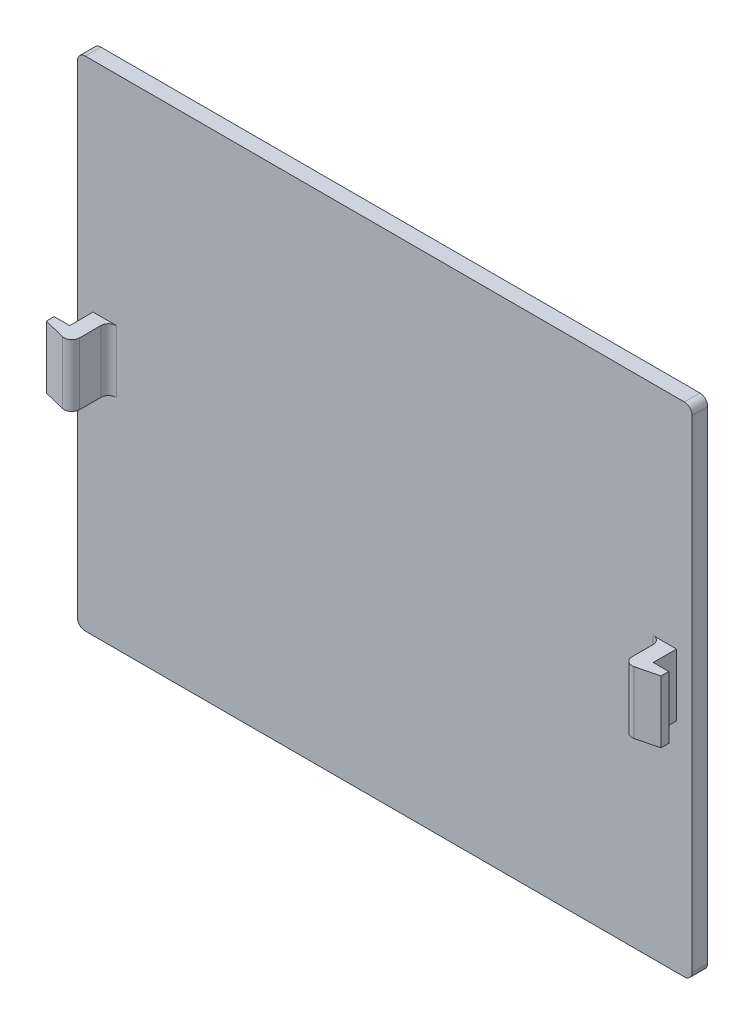
ISO-10303-21;
HEADER;
FILE_DESCRIPTION(('STEP AP214'),'2;1');
FILE_NAME('part.step','',(''),(''),'','','');
FILE_SCHEMA(('AUTOMOTIVE_DESIGN { 1 0 10303 214 1 1 1 1 }'));
ENDSEC;
DATA;
#1=APPLICATION_CONTEXT('core data for automotive mechanical design processes');
#2=APPLICATION_PROTOCOL_DEFINITION('international standard','automotive_design',2000,#1);
#3=PRODUCT_CONTEXT('',#1,'mechanical');
#4=PRODUCT('Part','Part','',(#3));
#5=PRODUCT_RELATED_PRODUCT_CATEGORY('part','',(#4));
#6=PRODUCT_DEFINITION_FORMATION('','',#4);
#7=PRODUCT_DEFINITION_CONTEXT('part definition',#1,'design');
#8=PRODUCT_DEFINITION('design','',#6,#7);
#9=PRODUCT_DEFINITION_SHAPE('','',#8);
#10=(LENGTH_UNIT() NAMED_UNIT(*) SI_UNIT(.MILLI.,.METRE.));
#11=(NAMED_UNIT(*) PLANE_ANGLE_UNIT() SI_UNIT($,.RADIAN.));
#12=(NAMED_UNIT(*) SI_UNIT($,.STERADIAN.) SOLID_ANGLE_UNIT());
#13=UNCERTAINTY_MEASURE_WITH_UNIT(LENGTH_MEASURE(1.E-05),#10,'distance_accuracy_value','');
#14=(GEOMETRIC_REPRESENTATION_CONTEXT(3) GLOBAL_UNCERTAINTY_ASSIGNED_CONTEXT((#13)) GLOBAL_UNIT_ASSIGNED_CONTEXT((#10,
#11,#12)) REPRESENTATION_CONTEXT('',''));
#15=CARTESIAN_POINT('',(0.,0.,0.));
#16=DIRECTION('',(0.,0.,1.));
#17=DIRECTION('',(1.,0.,0.));
#18=AXIS2_PLACEMENT_3D('',#15,#16,#17);
#19=CARTESIAN_POINT('',(0.,0.,2.));
#20=DIRECTION('',(0.,0.,1.));
#21=DIRECTION('',(1.,0.,0.));
#22=AXIS2_PLACEMENT_3D('',#19,#20,#21);
#23=PLANE('',#22);
#24=DIRECTION('',(1.,0.,0.));
#25=VECTOR('',#24,1.);
#26=CARTESIAN_POINT('',(0.,-28.3454517134362,2.));
#27=LINE('',#26,#25);
#28=CARTESIAN_POINT('',(-37.7574901503001,-28.3454517134362,2.));
#29=VERTEX_POINT('',#28);
#30=CARTESIAN_POINT('',(39.2425098496999,-28.3454517134362,2.));
#31=VERTEX_POINT('',#30);
#32=EDGE_CURVE('E335',#29,#31,#27,.T.);
#33=ORIENTED_EDGE('',*,*,#32,.T.);
#34=CARTESIAN_POINT('',(39.2425098496999,-27.3454517134362,2.));
#35=DIRECTION('',(0.,0.,1.));
#36=DIRECTION('',(1.,0.,0.));
#37=AXIS2_PLACEMENT_3D('',#34,#35,#36);
#38=CIRCLE('',#37,1.);
#39=CARTESIAN_POINT('',(40.2425098496999,-27.3454517134362,2.));
#40=VERTEX_POINT('',#39);
#41=EDGE_CURVE('E388',#31,#40,#38,.T.);
#42=ORIENTED_EDGE('',*,*,#41,.T.);
#43=DIRECTION('',(0.,1.,0.));
#44=VECTOR('',#43,1.);
#45=CARTESIAN_POINT('',(40.2425098496999,0.,2.));
#46=LINE('',#45,#44);
#47=CARTESIAN_POINT('',(40.2425098496999,34.6545482865638,2.));
#48=VERTEX_POINT('',#47);
#49=EDGE_CURVE('E322',#40,#48,#46,.T.);
#50=ORIENTED_EDGE('',*,*,#49,.T.);
#51=CARTESIAN_POINT('',(39.2425098496999,34.6545482865638,2.));
#52=DIRECTION('',(0.,0.,1.));
#53=DIRECTION('',(1.,0.,0.));
#54=AXIS2_PLACEMENT_3D('',#51,#52,#53);
#55=CIRCLE('',#54,1.);
#56=CARTESIAN_POINT('',(39.2425098496999,35.6545482865638,2.));
#57=VERTEX_POINT('',#56);
#58=EDGE_CURVE('E385',#48,#57,#55,.T.);
#59=ORIENTED_EDGE('',*,*,#58,.T.);
#60=DIRECTION('',(1.,0.,0.));
#61=VECTOR('',#60,1.);
#62=CARTESIAN_POINT('',(0.,35.6545482865638,2.));
#63=LINE('',#62,#61);
#64=CARTESIAN_POINT('',(-37.7574901503001,35.6545482865638,2.));
#65=VERTEX_POINT('',#64);
#66=EDGE_CURVE('E326',#65,#57,#63,.T.);
#67=ORIENTED_EDGE('',*,*,#66,.F.);
#68=CARTESIAN_POINT('',(-37.7574901503001,34.6545482865638,2.));
#69=DIRECTION('',(0.,0.,1.));
#70=DIRECTION('',(1.,0.,0.));
#71=AXIS2_PLACEMENT_3D('',#68,#69,#70);
#72=CIRCLE('',#71,1.);
#73=CARTESIAN_POINT('',(-38.7574901503001,34.6545482865638,2.));
#74=VERTEX_POINT('',#73);
#75=EDGE_CURVE('E382',#65,#74,#72,.T.);
#76=ORIENTED_EDGE('',*,*,#75,.T.);
#77=DIRECTION('',(0.,1.,0.));
#78=VECTOR('',#77,1.);
#79=CARTESIAN_POINT('',(-38.7574901503001,0.,2.));
#80=LINE('',#79,#78);
#81=CARTESIAN_POINT('',(-38.7574901503001,-27.3454517134362,2.));
#82=VERTEX_POINT('',#81);
#83=EDGE_CURVE('E331',#82,#74,#80,.T.);
#84=ORIENTED_EDGE('',*,*,#83,.F.);
#85=CARTESIAN_POINT('',(-37.7574901503001,-27.3454517134362,2.));
#86=DIRECTION('',(0.,0.,1.));
#87=DIRECTION('',(1.,0.,0.));
#88=AXIS2_PLACEMENT_3D('',#85,#86,#87);
#89=CIRCLE('',#88,1.);
#90=EDGE_CURVE('E379',#82,#29,#89,.T.);
#91=ORIENTED_EDGE('',*,*,#90,.T.);
#92=EDGE_LOOP('',(#33,#42,#50,#59,#67,#76,#84,#91));
#93=FACE_BOUND('',#92,.T.);
#94=DIRECTION('',(0.,-1.,0.));
#95=VECTOR('',#94,1.);
#96=CARTESIAN_POINT('',(-33.7574901503001,-0.345451713436189,2.));
#97=LINE('',#96,#95);
#98=CARTESIAN_POINT('',(-33.7574901503001,7.65454828656381,2.));
#99=VERTEX_POINT('',#98);
#100=CARTESIAN_POINT('',(-33.7574901503001,-0.345451713436189,2.));
#101=VERTEX_POINT('',#100);
#102=EDGE_CURVE('E425',#99,#101,#97,.T.);
#103=ORIENTED_EDGE('',*,*,#102,.T.);
#104=DIRECTION('',(-1.,0.,0.));
#105=VECTOR('',#104,1.);
#106=CARTESIAN_POINT('',(0.,-0.345451713436189,2.));
#107=LINE('',#106,#105);
#108=CARTESIAN_POINT('',(-36.7574901503001,-0.345451713436189,2.));
#109=VERTEX_POINT('',#108);
#110=EDGE_CURVE('E296',#101,#109,#107,.T.);
#111=ORIENTED_EDGE('',*,*,#110,.T.);
#112=DIRECTION('',(0.,-1.,0.));
#113=VECTOR('',#112,1.);
#114=CARTESIAN_POINT('',(-36.7574901503001,0.,2.));
#115=LINE('',#114,#113);
#116=CARTESIAN_POINT('',(-36.7574901503001,7.65454828656381,2.));
#117=VERTEX_POINT('',#116);
#118=EDGE_CURVE('E300',#117,#109,#115,.T.);
#119=ORIENTED_EDGE('',*,*,#118,.F.);
#120=DIRECTION('',(-1.,0.,0.));
#121=VECTOR('',#120,1.);
#122=CARTESIAN_POINT('',(0.,7.65454828656381,2.));
#123=LINE('',#122,#121);
#124=EDGE_CURVE('E290',#99,#117,#123,.T.);
#125=ORIENTED_EDGE('',*,*,#124,.F.);
#126=EDGE_LOOP('',(#103,#111,#119,#125));
#127=FACE_BOUND('',#126,.T.);
#128=DIRECTION('',(1.,0.,0.));
#129=VECTOR('',#128,1.);
#130=CARTESIAN_POINT('',(0.,-0.345451713436189,2.));
#131=LINE('',#130,#129);
#132=CARTESIAN_POINT('',(35.2425098496999,-0.345451713436189,2.));
#133=VERTEX_POINT('',#132);
#134=CARTESIAN_POINT('',(38.2425098496999,-0.345451713436189,2.));
#135=VERTEX_POINT('',#134);
#136=EDGE_CURVE('E259',#133,#135,#131,.T.);
#137=ORIENTED_EDGE('',*,*,#136,.F.);
#138=DIRECTION('',(0.,-1.,0.));
#139=VECTOR('',#138,1.);
#140=CARTESIAN_POINT('',(35.2425098496999,0.,2.));
#141=LINE('',#140,#139);
#142=CARTESIAN_POINT('',(35.2425098496999,7.65454828656381,2.));
#143=VERTEX_POINT('',#142);
#144=EDGE_CURVE('E421',#133,#143,#141,.F.);
#145=ORIENTED_EDGE('',*,*,#144,.T.);
#146=DIRECTION('',(1.,0.,0.));
#147=VECTOR('',#146,1.);
#148=CARTESIAN_POINT('',(0.,7.65454828656381,2.));
#149=LINE('',#148,#147);
#150=CARTESIAN_POINT('',(38.2425098496999,7.65454828656381,2.));
#151=VERTEX_POINT('',#150);
#152=EDGE_CURVE('E267',#143,#151,#149,.T.);
#153=ORIENTED_EDGE('',*,*,#152,.T.);
#154=DIRECTION('',(0.,-1.,0.));
#155=VECTOR('',#154,1.);
#156=CARTESIAN_POINT('',(38.2425098496999,0.,2.));
#157=LINE('',#156,#155);
#158=EDGE_CURVE('E271',#151,#135,#157,.T.);
#159=ORIENTED_EDGE('',*,*,#158,.T.);
#160=EDGE_LOOP('',(#137,#145,#153,#159));
#161=FACE_BOUND('',#160,.T.);
#162=ADVANCED_FACE('F47',(#93,#127,#161),#23,.T.);
#163=CARTESIAN_POINT('',(40.2425098496999,0.,2.));
#164=DIRECTION('',(-1.,0.,0.));
#165=DIRECTION('',(0.,-1.,0.));
#166=AXIS2_PLACEMENT_3D('',#163,#164,#165);
#167=PLANE('',#166);
#168=ORIENTED_EDGE('',*,*,#49,.F.);
#169=DIRECTION('',(0.,0.,-1.));
#170=VECTOR('',#169,1.);
#171=CARTESIAN_POINT('',(40.2425098496999,-27.3454517134362,2.));
#172=LINE('',#171,#170);
#173=CARTESIAN_POINT('',(40.2425098496999,-27.3454517134362,0.));
#174=VERTEX_POINT('',#173);
#175=EDGE_CURVE('E356',#40,#174,#172,.T.);
#176=ORIENTED_EDGE('',*,*,#175,.T.);
#177=DIRECTION('',(0.,1.,0.));
#178=VECTOR('',#177,1.);
#179=CARTESIAN_POINT('',(40.2425098496999,0.,0.));
#180=LINE('',#179,#178);
#181=CARTESIAN_POINT('',(40.2425098496999,34.6545482865638,0.));
#182=VERTEX_POINT('',#181);
#183=EDGE_CURVE('E321',#174,#182,#180,.T.);
#184=ORIENTED_EDGE('',*,*,#183,.T.);
#185=DIRECTION('',(0.,0.,-1.));
#186=VECTOR('',#185,1.);
#187=CARTESIAN_POINT('',(40.2425098496999,34.6545482865638,2.));
#188=LINE('',#187,#186);
#189=EDGE_CURVE('E339',#182,#48,#188,.F.);
#190=ORIENTED_EDGE('',*,*,#189,.T.);
#191=EDGE_LOOP('',(#168,#176,#184,#190));
#192=FACE_BOUND('',#191,.T.);
#193=ADVANCED_FACE('F528',(#192),#167,.F.);
#194=CARTESIAN_POINT('',(0.,35.6545482865638,2.));
#195=DIRECTION('',(0.,1.,0.));
#196=DIRECTION('',(0.,0.,1.));
#197=AXIS2_PLACEMENT_3D('',#194,#195,#196);
#198=PLANE('',#197);
#199=ORIENTED_EDGE('',*,*,#66,.T.);
#200=DIRECTION('',(0.,0.,-1.));
#201=VECTOR('',#200,1.);
#202=CARTESIAN_POINT('',(39.2425098496999,35.6545482865638,0.));
#203=LINE('',#202,#201);
#204=CARTESIAN_POINT('',(39.2425098496999,35.6545482865638,0.));
#205=VERTEX_POINT('',#204);
#206=EDGE_CURVE('E394',#57,#205,#203,.T.);
#207=ORIENTED_EDGE('',*,*,#206,.T.);
#208=DIRECTION('',(1.,0.,0.));
#209=VECTOR('',#208,1.);
#210=CARTESIAN_POINT('',(0.,35.6545482865638,0.));
#211=LINE('',#210,#209);
#212=CARTESIAN_POINT('',(-37.7574901503001,35.6545482865638,0.));
#213=VERTEX_POINT('',#212);
#214=EDGE_CURVE('E343',#213,#205,#211,.T.);
#215=ORIENTED_EDGE('',*,*,#214,.F.);
#216=DIRECTION('',(0.,0.,-1.));
#217=VECTOR('',#216,1.);
#218=CARTESIAN_POINT('',(-37.7574901503001,35.6545482865638,2.));
#219=LINE('',#218,#217);
#220=EDGE_CURVE('E391',#213,#65,#219,.F.);
#221=ORIENTED_EDGE('',*,*,#220,.T.);
#222=EDGE_LOOP('',(#199,#207,#215,#221));
#223=FACE_BOUND('',#222,.T.);
#224=ADVANCED_FACE('F535',(#223),#198,.T.);
#225=CARTESIAN_POINT('',(-38.7574901503001,0.,2.));
#226=DIRECTION('',(-1.,0.,0.));
#227=DIRECTION('',(0.,-1.,0.));
#228=AXIS2_PLACEMENT_3D('',#225,#226,#227);
#229=PLANE('',#228);
#230=ORIENTED_EDGE('',*,*,#83,.T.);
#231=DIRECTION('',(0.,0.,-1.));
#232=VECTOR('',#231,1.);
#233=CARTESIAN_POINT('',(-38.7574901503001,34.6545482865638,2.));
#234=LINE('',#233,#232);
#235=CARTESIAN_POINT('',(-38.7574901503001,34.6545482865638,0.));
#236=VERTEX_POINT('',#235);
#237=EDGE_CURVE('E401',#74,#236,#234,.T.);
#238=ORIENTED_EDGE('',*,*,#237,.T.);
#239=DIRECTION('',(0.,1.,0.));
#240=VECTOR('',#239,1.);
#241=CARTESIAN_POINT('',(-38.7574901503001,0.,0.));
#242=LINE('',#241,#240);
#243=CARTESIAN_POINT('',(-38.7574901503001,-27.3454517134362,0.));
#244=VERTEX_POINT('',#243);
#245=EDGE_CURVE('E347',#244,#236,#242,.T.);
#246=ORIENTED_EDGE('',*,*,#245,.F.);
#247=DIRECTION('',(0.,0.,-1.));
#248=VECTOR('',#247,1.);
#249=CARTESIAN_POINT('',(-38.7574901503001,-27.3454517134362,2.));
#250=LINE('',#249,#248);
#251=EDGE_CURVE('E398',#244,#82,#250,.F.);
#252=ORIENTED_EDGE('',*,*,#251,.T.);
#253=EDGE_LOOP('',(#230,#238,#246,#252));
#254=FACE_BOUND('',#253,.T.);
#255=ADVANCED_FACE('F545',(#254),#229,.T.);
#256=CARTESIAN_POINT('',(0.,-28.3454517134362,2.));
#257=DIRECTION('',(0.,1.,0.));
#258=DIRECTION('',(0.,0.,1.));
#259=AXIS2_PLACEMENT_3D('',#256,#257,#258);
#260=PLANE('',#259);
#261=DIRECTION('',(1.,0.,0.));
#262=VECTOR('',#261,1.);
#263=CARTESIAN_POINT('',(0.,-28.3454517134362,0.));
#264=LINE('',#263,#262);
#265=CARTESIAN_POINT('',(-37.7574901503001,-28.3454517134362,0.));
#266=VERTEX_POINT('',#265);
#267=CARTESIAN_POINT('',(39.2425098496999,-28.3454517134362,0.));
#268=VERTEX_POINT('',#267);
#269=EDGE_CURVE('E327',#266,#268,#264,.T.);
#270=ORIENTED_EDGE('',*,*,#269,.T.);
#271=DIRECTION('',(0.,0.,-1.));
#272=VECTOR('',#271,1.);
#273=CARTESIAN_POINT('',(39.2425098496999,-28.3454517134362,2.));
#274=LINE('',#273,#272);
#275=EDGE_CURVE('E376',#268,#31,#274,.F.);
#276=ORIENTED_EDGE('',*,*,#275,.T.);
#277=ORIENTED_EDGE('',*,*,#32,.F.);
#278=DIRECTION('',(0.,0.,-1.));
#279=VECTOR('',#278,1.);
#280=CARTESIAN_POINT('',(-37.7574901503001,-28.3454517134362,0.));
#281=LINE('',#280,#279);
#282=EDGE_CURVE('E372',#29,#266,#281,.T.);
#283=ORIENTED_EDGE('',*,*,#282,.T.);
#284=EDGE_LOOP('',(#270,#276,#277,#283));
#285=FACE_BOUND('',#284,.T.);
#286=ADVANCED_FACE('F541',(#285),#260,.F.);
#287=CARTESIAN_POINT('',(0.,0.,0.));
#288=DIRECTION('',(0.,0.,1.));
#289=DIRECTION('',(1.,0.,0.));
#290=AXIS2_PLACEMENT_3D('',#287,#288,#289);
#291=PLANE('',#290);
#292=ORIENTED_EDGE('',*,*,#183,.F.);
#293=CARTESIAN_POINT('',(39.2425098496999,-27.3454517134362,0.));
#294=DIRECTION('',(0.,0.,1.));
#295=DIRECTION('',(1.,0.,0.));
#296=AXIS2_PLACEMENT_3D('',#293,#294,#295);
#297=CIRCLE('',#296,1.);
#298=EDGE_CURVE('E369',#174,#268,#297,.F.);
#299=ORIENTED_EDGE('',*,*,#298,.T.);
#300=ORIENTED_EDGE('',*,*,#269,.F.);
#301=CARTESIAN_POINT('',(-37.7574901503001,-27.3454517134362,0.));
#302=DIRECTION('',(0.,0.,1.));
#303=DIRECTION('',(1.,0.,0.));
#304=AXIS2_PLACEMENT_3D('',#301,#302,#303);
#305=CIRCLE('',#304,1.);
#306=EDGE_CURVE('E360',#266,#244,#305,.F.);
#307=ORIENTED_EDGE('',*,*,#306,.T.);
#308=ORIENTED_EDGE('',*,*,#245,.T.);
#309=CARTESIAN_POINT('',(-37.7574901503001,34.6545482865638,0.));
#310=DIRECTION('',(0.,0.,1.));
#311=DIRECTION('',(1.,0.,0.));
#312=AXIS2_PLACEMENT_3D('',#309,#310,#311);
#313=CIRCLE('',#312,1.);
#314=EDGE_CURVE('E363',#236,#213,#313,.F.);
#315=ORIENTED_EDGE('',*,*,#314,.T.);
#316=ORIENTED_EDGE('',*,*,#214,.T.);
#317=CARTESIAN_POINT('',(39.2425098496999,34.6545482865638,0.));
#318=DIRECTION('',(0.,0.,1.));
#319=DIRECTION('',(1.,0.,0.));
#320=AXIS2_PLACEMENT_3D('',#317,#318,#319);
#321=CIRCLE('',#320,1.);
#322=EDGE_CURVE('E366',#205,#182,#321,.F.);
#323=ORIENTED_EDGE('',*,*,#322,.T.);
#324=EDGE_LOOP('',(#292,#299,#300,#307,#308,#315,#316,#323));
#325=FACE_BOUND('',#324,.T.);
#326=ADVANCED_FACE('F525',(#325),#291,.F.);
#327=CARTESIAN_POINT('',(0.,7.65454828656381,5.));
#328=DIRECTION('',(0.,-1.,0.));
#329=DIRECTION('',(0.,0.,-1.));
#330=AXIS2_PLACEMENT_3D('',#327,#328,#329);
#331=PLANE('',#330);
#332=DIRECTION('',(0.970142500145332,0.,0.242535625036333));
#333=VECTOR('',#332,1.);
#334=CARTESIAN_POINT('',(-2.51514647942942,7.65454828656381,15.0605859177177));
#335=LINE('',#334,#333);
#336=CARTESIAN_POINT('',(-38.7574901503001,7.65454828656381,6.));
#337=VERTEX_POINT('',#336);
#338=CARTESIAN_POINT('',(-36.0000257753364,7.65454828656381,6.68936609374092));
#339=VERTEX_POINT('',#338);
#340=EDGE_CURVE('E471',#337,#339,#335,.T.);
#341=ORIENTED_EDGE('',*,*,#340,.T.);
#342=CARTESIAN_POINT('',(-35.7574901503001,7.65454828656381,5.71922359359559));
#343=DIRECTION('',(0.,-1.,0.));
#344=DIRECTION('',(0.,0.,-1.));
#345=AXIS2_PLACEMENT_3D('',#342,#343,#344);
#346=CIRCLE('',#345,1.);
#347=CARTESIAN_POINT('',(-34.7574901503001,7.65454828656381,5.71922359359559));
#348=VERTEX_POINT('',#347);
#349=EDGE_CURVE('E418',#339,#348,#346,.F.);
#350=ORIENTED_EDGE('',*,*,#349,.T.);
#351=DIRECTION('',(0.,0.,-1.));
#352=VECTOR('',#351,1.);
#353=CARTESIAN_POINT('',(-34.7574901503001,7.65454828656381,5.));
#354=LINE('',#353,#352);
#355=CARTESIAN_POINT('',(-34.7574901503001,7.65454828656381,3.));
#356=VERTEX_POINT('',#355);
#357=EDGE_CURVE('E295',#348,#356,#354,.T.);
#358=ORIENTED_EDGE('',*,*,#357,.T.);
#359=CARTESIAN_POINT('',(-33.7574901503001,7.65454828656381,3.));
#360=DIRECTION('',(0.,-1.,0.));
#361=DIRECTION('',(0.,0.,-1.));
#362=AXIS2_PLACEMENT_3D('',#359,#360,#361);
#363=CIRCLE('',#362,1.);
#364=EDGE_CURVE('E446',#356,#99,#363,.T.);
#365=ORIENTED_EDGE('',*,*,#364,.T.);
#366=ORIENTED_EDGE('',*,*,#124,.T.);
#367=DIRECTION('',(0.,0.,-1.));
#368=VECTOR('',#367,1.);
#369=CARTESIAN_POINT('',(-36.7574901503001,7.65454828656381,5.));
#370=LINE('',#369,#368);
#371=CARTESIAN_POINT('',(-36.7574901503001,7.65454828656381,5.));
#372=VERTEX_POINT('',#371);
#373=EDGE_CURVE('E317',#372,#117,#370,.T.);
#374=ORIENTED_EDGE('',*,*,#373,.F.);
#375=DIRECTION('',(-1.,0.,0.));
#376=VECTOR('',#375,1.);
#377=CARTESIAN_POINT('',(0.,7.65454828656381,5.));
#378=LINE('',#377,#376);
#379=CARTESIAN_POINT('',(-38.7574901503001,7.65454828656381,5.));
#380=VERTEX_POINT('',#379);
#381=EDGE_CURVE('E251',#372,#380,#378,.T.);
#382=ORIENTED_EDGE('',*,*,#381,.T.);
#383=DIRECTION('',(0.,0.,-1.));
#384=VECTOR('',#383,1.);
#385=CARTESIAN_POINT('',(-38.7574901503001,7.65454828656381,7.));
#386=LINE('',#385,#384);
#387=EDGE_CURVE('E256',#337,#380,#386,.T.);
#388=ORIENTED_EDGE('',*,*,#387,.F.);
#389=EDGE_LOOP('',(#341,#350,#358,#365,#366,#374,#382,#388));
#390=FACE_BOUND('',#389,.T.);
#391=ADVANCED_FACE('F489',(#390),#331,.F.);
#392=CARTESIAN_POINT('',(-36.7574901503001,0.,5.));
#393=DIRECTION('',(1.,0.,0.));
#394=DIRECTION('',(0.,0.,-1.));
#395=AXIS2_PLACEMENT_3D('',#392,#393,#394);
#396=PLANE('',#395);
#397=ORIENTED_EDGE('',*,*,#118,.T.);
#398=DIRECTION('',(0.,0.,-1.));
#399=VECTOR('',#398,1.);
#400=CARTESIAN_POINT('',(-36.7574901503001,-0.345451713436189,5.));
#401=LINE('',#400,#399);
#402=CARTESIAN_POINT('',(-36.7574901503001,-0.345451713436189,5.));
#403=VERTEX_POINT('',#402);
#404=EDGE_CURVE('E313',#403,#109,#401,.T.);
#405=ORIENTED_EDGE('',*,*,#404,.F.);
#406=DIRECTION('',(0.,-1.,0.));
#407=VECTOR('',#406,1.);
#408=CARTESIAN_POINT('',(-36.7574901503001,0.,5.));
#409=LINE('',#408,#407);
#410=EDGE_CURVE('E291',#372,#403,#409,.T.);
#411=ORIENTED_EDGE('',*,*,#410,.F.);
#412=ORIENTED_EDGE('',*,*,#373,.T.);
#413=EDGE_LOOP('',(#397,#405,#411,#412));
#414=FACE_BOUND('',#413,.T.);
#415=ADVANCED_FACE('F516',(#414),#396,.F.);
#416=CARTESIAN_POINT('',(0.,-0.345451713436189,5.));
#417=DIRECTION('',(0.,-1.,0.));
#418=DIRECTION('',(0.,0.,-1.));
#419=AXIS2_PLACEMENT_3D('',#416,#417,#418);
#420=PLANE('',#419);
#421=DIRECTION('',(0.,0.,-1.));
#422=VECTOR('',#421,1.);
#423=CARTESIAN_POINT('',(-34.7574901503001,-0.345451713436189,5.));
#424=LINE('',#423,#422);
#425=CARTESIAN_POINT('',(-34.7574901503001,-0.345451713436189,5.71922359359559));
#426=VERTEX_POINT('',#425);
#427=CARTESIAN_POINT('',(-34.7574901503001,-0.345451713436189,3.));
#428=VERTEX_POINT('',#427);
#429=EDGE_CURVE('E309',#426,#428,#424,.T.);
#430=ORIENTED_EDGE('',*,*,#429,.F.);
#431=CARTESIAN_POINT('',(-35.7574901503001,-0.345451713436189,5.71922359359559));
#432=DIRECTION('',(0.,-1.,0.));
#433=DIRECTION('',(0.,0.,-1.));
#434=AXIS2_PLACEMENT_3D('',#431,#432,#433);
#435=CIRCLE('',#434,1.);
#436=CARTESIAN_POINT('',(-36.0000257753364,-0.345451713436189,6.68936609374092));
#437=VERTEX_POINT('',#436);
#438=EDGE_CURVE('E412',#426,#437,#435,.T.);
#439=ORIENTED_EDGE('',*,*,#438,.T.);
#440=DIRECTION('',(0.970142500145332,0.,0.242535625036333));
#441=VECTOR('',#440,1.);
#442=CARTESIAN_POINT('',(-2.51514647942942,-0.345451713436189,15.0605859177177));
#443=LINE('',#442,#441);
#444=CARTESIAN_POINT('',(-38.7574901503001,-0.345451713436189,6.));
#445=VERTEX_POINT('',#444);
#446=EDGE_CURVE('E219',#445,#437,#443,.T.);
#447=ORIENTED_EDGE('',*,*,#446,.F.);
#448=DIRECTION('',(0.,0.,-1.));
#449=VECTOR('',#448,1.);
#450=CARTESIAN_POINT('',(-38.7574901503001,-0.345451713436188,7.));
#451=LINE('',#450,#449);
#452=CARTESIAN_POINT('',(-38.7574901503001,-0.345451713436188,5.));
#453=VERTEX_POINT('',#452);
#454=EDGE_CURVE('E255',#445,#453,#451,.T.);
#455=ORIENTED_EDGE('',*,*,#454,.T.);
#456=DIRECTION('',(-1.,0.,0.));
#457=VECTOR('',#456,1.);
#458=CARTESIAN_POINT('',(0.,-0.345451713436189,5.));
#459=LINE('',#458,#457);
#460=EDGE_CURVE('E237',#403,#453,#459,.T.);
#461=ORIENTED_EDGE('',*,*,#460,.F.);
#462=ORIENTED_EDGE('',*,*,#404,.T.);
#463=ORIENTED_EDGE('',*,*,#110,.F.);
#464=CARTESIAN_POINT('',(-33.7574901503001,-0.345451713436189,3.));
#465=DIRECTION('',(0.,-1.,0.));
#466=DIRECTION('',(0.,0.,-1.));
#467=AXIS2_PLACEMENT_3D('',#464,#465,#466);
#468=CIRCLE('',#467,1.);
#469=EDGE_CURVE('E443',#101,#428,#468,.F.);
#470=ORIENTED_EDGE('',*,*,#469,.T.);
#471=EDGE_LOOP('',(#430,#439,#447,#455,#461,#462,#463,#470));
#472=FACE_BOUND('',#471,.T.);
#473=ADVANCED_FACE('F499',(#472),#420,.T.);
#474=CARTESIAN_POINT('',(-34.7574901503001,0.,5.));
#475=DIRECTION('',(1.,0.,0.));
#476=DIRECTION('',(0.,0.,-1.));
#477=AXIS2_PLACEMENT_3D('',#474,#475,#476);
#478=PLANE('',#477);
#479=ORIENTED_EDGE('',*,*,#357,.F.);
#480=DIRECTION('',(0.,-1.,0.));
#481=VECTOR('',#480,1.);
#482=CARTESIAN_POINT('',(-34.7574901503001,-0.345451713436189,5.71922359359559));
#483=LINE('',#482,#481);
#484=EDGE_CURVE('E408',#348,#426,#483,.T.);
#485=ORIENTED_EDGE('',*,*,#484,.T.);
#486=ORIENTED_EDGE('',*,*,#429,.T.);
#487=DIRECTION('',(0.,-1.,0.));
#488=VECTOR('',#487,1.);
#489=CARTESIAN_POINT('',(-34.7574901503001,7.65454828656381,3.));
#490=LINE('',#489,#488);
#491=EDGE_CURVE('E405',#428,#356,#490,.F.);
#492=ORIENTED_EDGE('',*,*,#491,.T.);
#493=EDGE_LOOP('',(#479,#485,#486,#492));
#494=FACE_BOUND('',#493,.T.);
#495=ADVANCED_FACE('F508',(#494),#478,.T.);
#496=CARTESIAN_POINT('',(36.2425098496999,0.,5.));
#497=DIRECTION('',(1.,0.,0.));
#498=DIRECTION('',(0.,0.,-1.));
#499=AXIS2_PLACEMENT_3D('',#496,#497,#498);
#500=PLANE('',#499);
#501=DIRECTION('',(0.,0.,-1.));
#502=VECTOR('',#501,1.);
#503=CARTESIAN_POINT('',(36.2425098496999,-0.345451713436189,5.));
#504=LINE('',#503,#502);
#505=CARTESIAN_POINT('',(36.2425098496999,-0.345451713436189,5.71922359359559));
#506=VERTEX_POINT('',#505);
#507=CARTESIAN_POINT('',(36.2425098496999,-0.345451713436189,3.));
#508=VERTEX_POINT('',#507);
#509=EDGE_CURVE('E286',#506,#508,#504,.T.);
#510=ORIENTED_EDGE('',*,*,#509,.F.);
#511=DIRECTION('',(0.,-1.,0.));
#512=VECTOR('',#511,1.);
#513=CARTESIAN_POINT('',(36.2425098496999,0.,5.71922359359559));
#514=LINE('',#513,#512);
#515=CARTESIAN_POINT('',(36.2425098496999,7.65454828656381,5.71922359359559));
#516=VERTEX_POINT('',#515);
#517=EDGE_CURVE('E68',#506,#516,#514,.F.);
#518=ORIENTED_EDGE('',*,*,#517,.T.);
#519=DIRECTION('',(0.,0.,-1.));
#520=VECTOR('',#519,1.);
#521=CARTESIAN_POINT('',(36.2425098496999,7.65454828656381,5.));
#522=LINE('',#521,#520);
#523=CARTESIAN_POINT('',(36.2425098496999,7.65454828656381,3.));
#524=VERTEX_POINT('',#523);
#525=EDGE_CURVE('E266',#516,#524,#522,.T.);
#526=ORIENTED_EDGE('',*,*,#525,.T.);
#527=DIRECTION('',(0.,-1.,0.));
#528=VECTOR('',#527,1.);
#529=CARTESIAN_POINT('',(36.2425098496999,0.,3.));
#530=LINE('',#529,#528);
#531=EDGE_CURVE('E434',#524,#508,#530,.T.);
#532=ORIENTED_EDGE('',*,*,#531,.T.);
#533=EDGE_LOOP('',(#510,#518,#526,#532));
#534=FACE_BOUND('',#533,.T.);
#535=ADVANCED_FACE('F578',(#534),#500,.F.);
#536=CARTESIAN_POINT('',(0.,-0.345451713436189,5.));
#537=DIRECTION('',(0.,1.,0.));
#538=DIRECTION('',(0.,0.,1.));
#539=AXIS2_PLACEMENT_3D('',#536,#537,#538);
#540=PLANE('',#539);
#541=DIRECTION('',(-0.970142500145332,0.,0.242535625036332));
#542=VECTOR('',#541,1.);
#543=CARTESIAN_POINT('',(2.60250057939409,-0.345451713436189,15.4100023175764));
#544=LINE('',#543,#542);
#545=CARTESIAN_POINT('',(40.2425098496999,-0.345451713436189,6.));
#546=VERTEX_POINT('',#545);
#547=CARTESIAN_POINT('',(37.4850454747363,-0.345451713436189,6.68936609374092));
#548=VERTEX_POINT('',#547);
#549=EDGE_CURVE('E208',#546,#548,#544,.T.);
#550=ORIENTED_EDGE('',*,*,#549,.T.);
#551=CARTESIAN_POINT('',(37.2425098496999,-0.345451713436189,5.71922359359559));
#552=DIRECTION('',(0.,1.,0.));
#553=DIRECTION('',(0.,0.,1.));
#554=AXIS2_PLACEMENT_3D('',#551,#552,#553);
#555=CIRCLE('',#554,1.);
#556=EDGE_CURVE('E431',#548,#506,#555,.F.);
#557=ORIENTED_EDGE('',*,*,#556,.T.);
#558=ORIENTED_EDGE('',*,*,#509,.T.);
#559=CARTESIAN_POINT('',(35.2425098496999,-0.345451713436189,3.));
#560=DIRECTION('',(0.,1.,0.));
#561=DIRECTION('',(0.,0.,1.));
#562=AXIS2_PLACEMENT_3D('',#559,#560,#561);
#563=CIRCLE('',#562,1.);
#564=EDGE_CURVE('E56',#508,#133,#563,.T.);
#565=ORIENTED_EDGE('',*,*,#564,.T.);
#566=ORIENTED_EDGE('',*,*,#136,.T.);
#567=DIRECTION('',(0.,0.,-1.));
#568=VECTOR('',#567,1.);
#569=CARTESIAN_POINT('',(38.2425098496999,-0.345451713436189,5.));
#570=LINE('',#569,#568);
#571=CARTESIAN_POINT('',(38.2425098496999,-0.345451713436189,5.));
#572=VERTEX_POINT('',#571);
#573=EDGE_CURVE('E282',#572,#135,#570,.T.);
#574=ORIENTED_EDGE('',*,*,#573,.F.);
#575=DIRECTION('',(1.,0.,0.));
#576=VECTOR('',#575,1.);
#577=CARTESIAN_POINT('',(0.,-0.345451713436189,5.));
#578=LINE('',#577,#576);
#579=CARTESIAN_POINT('',(40.2425098496999,-0.345451713436189,5.));
#580=VERTEX_POINT('',#579);
#581=EDGE_CURVE('E234',#572,#580,#578,.T.);
#582=ORIENTED_EDGE('',*,*,#581,.T.);
#583=DIRECTION('',(0.,0.,-1.));
#584=VECTOR('',#583,1.);
#585=CARTESIAN_POINT('',(40.2425098496999,-0.345451713436189,7.));
#586=LINE('',#585,#584);
#587=EDGE_CURVE('E226',#546,#580,#586,.T.);
#588=ORIENTED_EDGE('',*,*,#587,.F.);
#589=EDGE_LOOP('',(#550,#557,#558,#565,#566,#574,#582,#588));
#590=FACE_BOUND('',#589,.T.);
#591=ADVANCED_FACE('F232',(#590),#540,.F.);
#592=CARTESIAN_POINT('',(38.2425098496999,0.,5.));
#593=DIRECTION('',(1.,0.,0.));
#594=DIRECTION('',(0.,0.,-1.));
#595=AXIS2_PLACEMENT_3D('',#592,#593,#594);
#596=PLANE('',#595);
#597=ORIENTED_EDGE('',*,*,#158,.F.);
#598=DIRECTION('',(0.,0.,-1.));
#599=VECTOR('',#598,1.);
#600=CARTESIAN_POINT('',(38.2425098496999,7.65454828656381,5.));
#601=LINE('',#600,#599);
#602=CARTESIAN_POINT('',(38.2425098496999,7.65454828656381,5.));
#603=VERTEX_POINT('',#602);
#604=EDGE_CURVE('E278',#603,#151,#601,.T.);
#605=ORIENTED_EDGE('',*,*,#604,.F.);
#606=DIRECTION('',(0.,-1.,0.));
#607=VECTOR('',#606,1.);
#608=CARTESIAN_POINT('',(38.2425098496999,0.,5.));
#609=LINE('',#608,#607);
#610=EDGE_CURVE('E262',#603,#572,#609,.T.);
#611=ORIENTED_EDGE('',*,*,#610,.T.);
#612=ORIENTED_EDGE('',*,*,#573,.T.);
#613=EDGE_LOOP('',(#597,#605,#611,#612));
#614=FACE_BOUND('',#613,.T.);
#615=ADVANCED_FACE('F458',(#614),#596,.T.);
#616=CARTESIAN_POINT('',(0.,7.65454828656381,5.));
#617=DIRECTION('',(0.,1.,0.));
#618=DIRECTION('',(0.,0.,1.));
#619=AXIS2_PLACEMENT_3D('',#616,#617,#618);
#620=PLANE('',#619);
#621=ORIENTED_EDGE('',*,*,#525,.F.);
#622=CARTESIAN_POINT('',(37.2425098496999,7.65454828656381,5.71922359359559));
#623=DIRECTION('',(0.,1.,0.));
#624=DIRECTION('',(0.,0.,1.));
#625=AXIS2_PLACEMENT_3D('',#622,#623,#624);
#626=CIRCLE('',#625,1.);
#627=CARTESIAN_POINT('',(37.4850454747363,7.65454828656381,6.68936609374092));
#628=VERTEX_POINT('',#627);
#629=EDGE_CURVE('E440',#516,#628,#626,.T.);
#630=ORIENTED_EDGE('',*,*,#629,.T.);
#631=DIRECTION('',(-0.970142500145332,0.,0.242535625036332));
#632=VECTOR('',#631,1.);
#633=CARTESIAN_POINT('',(2.60250057939409,7.65454828656381,15.4100023175764));
#634=LINE('',#633,#632);
#635=CARTESIAN_POINT('',(40.2425098496999,7.65454828656381,6.));
#636=VERTEX_POINT('',#635);
#637=EDGE_CURVE('E220',#636,#628,#634,.T.);
#638=ORIENTED_EDGE('',*,*,#637,.F.);
#639=DIRECTION('',(0.,0.,-1.));
#640=VECTOR('',#639,1.);
#641=CARTESIAN_POINT('',(40.2425098496999,7.65454828656381,7.));
#642=LINE('',#641,#640);
#643=CARTESIAN_POINT('',(40.2425098496999,7.65454828656381,5.));
#644=VERTEX_POINT('',#643);
#645=EDGE_CURVE('E228',#636,#644,#642,.T.);
#646=ORIENTED_EDGE('',*,*,#645,.T.);
#647=DIRECTION('',(1.,0.,0.));
#648=VECTOR('',#647,1.);
#649=CARTESIAN_POINT('',(0.,7.65454828656381,5.));
#650=LINE('',#649,#648);
#651=EDGE_CURVE('E244',#603,#644,#650,.T.);
#652=ORIENTED_EDGE('',*,*,#651,.F.);
#653=ORIENTED_EDGE('',*,*,#604,.T.);
#654=ORIENTED_EDGE('',*,*,#152,.F.);
#655=CARTESIAN_POINT('',(35.2425098496999,7.65454828656381,3.));
#656=DIRECTION('',(0.,1.,0.));
#657=DIRECTION('',(0.,0.,1.));
#658=AXIS2_PLACEMENT_3D('',#655,#656,#657);
#659=CIRCLE('',#658,1.);
#660=EDGE_CURVE('E11',#143,#524,#659,.F.);
#661=ORIENTED_EDGE('',*,*,#660,.T.);
#662=EDGE_LOOP('',(#621,#630,#638,#646,#652,#653,#654,#661));
#663=FACE_BOUND('',#662,.T.);
#664=ADVANCED_FACE('F463',(#663),#620,.T.);
#665=CARTESIAN_POINT('',(0.,0.,5.));
#666=DIRECTION('',(0.,0.,1.));
#667=DIRECTION('',(1.,0.,0.));
#668=AXIS2_PLACEMENT_3D('',#665,#666,#667);
#669=PLANE('',#668);
#670=ORIENTED_EDGE('',*,*,#381,.F.);
#671=ORIENTED_EDGE('',*,*,#410,.T.);
#672=ORIENTED_EDGE('',*,*,#460,.T.);
#673=DIRECTION('',(0.,-1.,0.));
#674=VECTOR('',#673,1.);
#675=CARTESIAN_POINT('',(-38.7574901503001,0.,5.));
#676=LINE('',#675,#674);
#677=EDGE_CURVE('E242',#380,#453,#676,.T.);
#678=ORIENTED_EDGE('',*,*,#677,.F.);
#679=EDGE_LOOP('',(#670,#671,#672,#678));
#680=FACE_BOUND('',#679,.T.);
#681=ADVANCED_FACE('F495',(#680),#669,.F.);
#682=CARTESIAN_POINT('',(-38.7574901503001,0.,7.));
#683=DIRECTION('',(1.,0.,0.));
#684=DIRECTION('',(0.,1.,0.));
#685=AXIS2_PLACEMENT_3D('',#682,#683,#684);
#686=PLANE('',#685);
#687=ORIENTED_EDGE('',*,*,#454,.F.);
#688=DIRECTION('',(0.,1.,0.));
#689=VECTOR('',#688,1.);
#690=CARTESIAN_POINT('',(-38.7574901503001,-28.3454517134362,6.));
#691=LINE('',#690,#689);
#692=EDGE_CURVE('E230',#445,#337,#691,.T.);
#693=ORIENTED_EDGE('',*,*,#692,.T.);
#694=ORIENTED_EDGE('',*,*,#387,.T.);
#695=ORIENTED_EDGE('',*,*,#677,.T.);
#696=EDGE_LOOP('',(#687,#693,#694,#695));
#697=FACE_BOUND('',#696,.T.);
#698=ADVANCED_FACE('F485',(#697),#686,.F.);
#699=CARTESIAN_POINT('',(40.2425098496999,0.,7.));
#700=DIRECTION('',(1.,0.,0.));
#701=DIRECTION('',(0.,1.,0.));
#702=AXIS2_PLACEMENT_3D('',#699,#700,#701);
#703=PLANE('',#702);
#704=DIRECTION('',(0.,1.,0.));
#705=VECTOR('',#704,1.);
#706=CARTESIAN_POINT('',(40.2425098496999,-28.3454517134362,6.));
#707=LINE('',#706,#705);
#708=EDGE_CURVE('E212',#546,#636,#707,.T.);
#709=ORIENTED_EDGE('',*,*,#708,.F.);
#710=ORIENTED_EDGE('',*,*,#587,.T.);
#711=DIRECTION('',(0.,-1.,0.));
#712=VECTOR('',#711,1.);
#713=CARTESIAN_POINT('',(40.2425098496999,0.,5.));
#714=LINE('',#713,#712);
#715=EDGE_CURVE('E465',#644,#580,#714,.T.);
#716=ORIENTED_EDGE('',*,*,#715,.F.);
#717=ORIENTED_EDGE('',*,*,#645,.F.);
#718=EDGE_LOOP('',(#709,#710,#716,#717));
#719=FACE_BOUND('',#718,.T.);
#720=ADVANCED_FACE('F224',(#719),#703,.T.);
#721=CARTESIAN_POINT('',(0.,0.,5.));
#722=DIRECTION('',(0.,0.,1.));
#723=DIRECTION('',(1.,0.,0.));
#724=AXIS2_PLACEMENT_3D('',#721,#722,#723);
#725=PLANE('',#724);
#726=ORIENTED_EDGE('',*,*,#610,.F.);
#727=ORIENTED_EDGE('',*,*,#651,.T.);
#728=ORIENTED_EDGE('',*,*,#715,.T.);
#729=ORIENTED_EDGE('',*,*,#581,.F.);
#730=EDGE_LOOP('',(#726,#727,#728,#729));
#731=FACE_BOUND('',#730,.T.);
#732=ADVANCED_FACE('F462',(#731),#725,.F.);
#733=CARTESIAN_POINT('',(36.2425098496999,-28.3454517134362,7.));
#734=DIRECTION('',(-0.242535625036332,0.,-0.970142500145332));
#735=DIRECTION('',(-0.970142500145332,0.,0.242535625036332));
#736=AXIS2_PLACEMENT_3D('',#733,#734,#735);
#737=PLANE('',#736);
#738=ORIENTED_EDGE('',*,*,#637,.T.);
#739=DIRECTION('',(0.,-1.,0.));
#740=VECTOR('',#739,1.);
#741=CARTESIAN_POINT('',(37.4850454747362,-28.3454517134362,6.68936609374092));
#742=LINE('',#741,#740);
#743=EDGE_CURVE('E215',#628,#548,#742,.T.);
#744=ORIENTED_EDGE('',*,*,#743,.T.);
#745=ORIENTED_EDGE('',*,*,#549,.F.);
#746=ORIENTED_EDGE('',*,*,#708,.T.);
#747=EDGE_LOOP('',(#738,#744,#745,#746));
#748=FACE_BOUND('',#747,.T.);
#749=ADVANCED_FACE('F211',(#748),#737,.F.);
#750=CARTESIAN_POINT('',(-34.7574901503001,-28.3454517134362,7.));
#751=DIRECTION('',(0.242535625036333,0.,-0.970142500145332));
#752=DIRECTION('',(-0.970142500145332,0.,-0.242535625036333));
#753=AXIS2_PLACEMENT_3D('',#750,#751,#752);
#754=PLANE('',#753);
#755=ORIENTED_EDGE('',*,*,#446,.T.);
#756=DIRECTION('',(0.,-1.,0.));
#757=VECTOR('',#756,1.);
#758=CARTESIAN_POINT('',(-36.0000257753364,7.65454828656381,6.68936609374092));
#759=LINE('',#758,#757);
#760=EDGE_CURVE('E415',#437,#339,#759,.F.);
#761=ORIENTED_EDGE('',*,*,#760,.T.);
#762=ORIENTED_EDGE('',*,*,#340,.F.);
#763=ORIENTED_EDGE('',*,*,#692,.F.);
#764=EDGE_LOOP('',(#755,#761,#762,#763));
#765=FACE_BOUND('',#764,.T.);
#766=ADVANCED_FACE('F501',(#765),#754,.F.);
#767=CARTESIAN_POINT('',(39.2425098496999,-27.3454517134362,2.));
#768=DIRECTION('',(0.,0.,-1.));
#769=DIRECTION('',(-1.,0.,0.));
#770=AXIS2_PLACEMENT_3D('',#767,#768,#769);
#771=CYLINDRICAL_SURFACE('',#770,1.);
#772=ORIENTED_EDGE('',*,*,#41,.F.);
#773=ORIENTED_EDGE('',*,*,#275,.F.);
#774=ORIENTED_EDGE('',*,*,#298,.F.);
#775=ORIENTED_EDGE('',*,*,#175,.F.);
#776=EDGE_LOOP('',(#772,#773,#774,#775));
#777=FACE_BOUND('',#776,.T.);
#778=ADVANCED_FACE('F553',(#777),#771,.T.);
#779=CARTESIAN_POINT('',(39.2425098496999,34.6545482865638,2.));
#780=DIRECTION('',(0.,0.,1.));
#781=DIRECTION('',(1.,0.,0.));
#782=AXIS2_PLACEMENT_3D('',#779,#780,#781);
#783=CYLINDRICAL_SURFACE('',#782,1.);
#784=ORIENTED_EDGE('',*,*,#58,.F.);
#785=ORIENTED_EDGE('',*,*,#189,.F.);
#786=ORIENTED_EDGE('',*,*,#322,.F.);
#787=ORIENTED_EDGE('',*,*,#206,.F.);
#788=EDGE_LOOP('',(#784,#785,#786,#787));
#789=FACE_BOUND('',#788,.T.);
#790=ADVANCED_FACE('F556',(#789),#783,.T.);
#791=CARTESIAN_POINT('',(-37.7574901503001,34.6545482865638,2.));
#792=DIRECTION('',(0.,0.,-1.));
#793=DIRECTION('',(-1.,0.,0.));
#794=AXIS2_PLACEMENT_3D('',#791,#792,#793);
#795=CYLINDRICAL_SURFACE('',#794,1.);
#796=ORIENTED_EDGE('',*,*,#75,.F.);
#797=ORIENTED_EDGE('',*,*,#220,.F.);
#798=ORIENTED_EDGE('',*,*,#314,.F.);
#799=ORIENTED_EDGE('',*,*,#237,.F.);
#800=EDGE_LOOP('',(#796,#797,#798,#799));
#801=FACE_BOUND('',#800,.T.);
#802=ADVANCED_FACE('F560',(#801),#795,.T.);
#803=CARTESIAN_POINT('',(-37.7574901503001,-27.3454517134362,2.));
#804=DIRECTION('',(0.,0.,1.));
#805=DIRECTION('',(1.,0.,0.));
#806=AXIS2_PLACEMENT_3D('',#803,#804,#805);
#807=CYLINDRICAL_SURFACE('',#806,1.);
#808=ORIENTED_EDGE('',*,*,#90,.F.);
#809=ORIENTED_EDGE('',*,*,#251,.F.);
#810=ORIENTED_EDGE('',*,*,#306,.F.);
#811=ORIENTED_EDGE('',*,*,#282,.F.);
#812=EDGE_LOOP('',(#808,#809,#810,#811));
#813=FACE_BOUND('',#812,.T.);
#814=ADVANCED_FACE('F564',(#813),#807,.T.);
#815=CARTESIAN_POINT('',(-35.7574901503001,0.,5.71922359359559));
#816=DIRECTION('',(0.,1.,0.));
#817=DIRECTION('',(0.,0.,1.));
#818=AXIS2_PLACEMENT_3D('',#815,#816,#817);
#819=CYLINDRICAL_SURFACE('',#818,1.);
#820=ORIENTED_EDGE('',*,*,#349,.F.);
#821=ORIENTED_EDGE('',*,*,#760,.F.);
#822=ORIENTED_EDGE('',*,*,#438,.F.);
#823=ORIENTED_EDGE('',*,*,#484,.F.);
#824=EDGE_LOOP('',(#820,#821,#822,#823));
#825=FACE_BOUND('',#824,.T.);
#826=ADVANCED_FACE('F503',(#825),#819,.T.);
#827=CARTESIAN_POINT('',(-33.7574901503001,0.,3.));
#828=DIRECTION('',(0.,1.,0.));
#829=DIRECTION('',(0.,0.,1.));
#830=AXIS2_PLACEMENT_3D('',#827,#828,#829);
#831=CYLINDRICAL_SURFACE('',#830,1.);
#832=ORIENTED_EDGE('',*,*,#364,.F.);
#833=ORIENTED_EDGE('',*,*,#491,.F.);
#834=ORIENTED_EDGE('',*,*,#469,.F.);
#835=ORIENTED_EDGE('',*,*,#102,.F.);
#836=EDGE_LOOP('',(#832,#833,#834,#835));
#837=FACE_BOUND('',#836,.T.);
#838=ADVANCED_FACE('F512',(#837),#831,.F.);
#839=CARTESIAN_POINT('',(37.2425098496999,-28.3454517134362,5.71922359359559));
#840=DIRECTION('',(0.,-1.,0.));
#841=DIRECTION('',(0.,0.,-1.));
#842=AXIS2_PLACEMENT_3D('',#839,#840,#841);
#843=CYLINDRICAL_SURFACE('',#842,1.);
#844=ORIENTED_EDGE('',*,*,#629,.F.);
#845=ORIENTED_EDGE('',*,*,#517,.F.);
#846=ORIENTED_EDGE('',*,*,#556,.F.);
#847=ORIENTED_EDGE('',*,*,#743,.F.);
#848=EDGE_LOOP('',(#844,#845,#846,#847));
#849=FACE_BOUND('',#848,.T.);
#850=ADVANCED_FACE('F571',(#849),#843,.T.);
#851=CARTESIAN_POINT('',(35.2425098496999,0.,3.));
#852=DIRECTION('',(0.,-1.,0.));
#853=DIRECTION('',(0.,0.,-1.));
#854=AXIS2_PLACEMENT_3D('',#851,#852,#853);
#855=CYLINDRICAL_SURFACE('',#854,1.);
#856=ORIENTED_EDGE('',*,*,#660,.F.);
#857=ORIENTED_EDGE('',*,*,#144,.F.);
#858=ORIENTED_EDGE('',*,*,#564,.F.);
#859=ORIENTED_EDGE('',*,*,#531,.F.);
#860=EDGE_LOOP('',(#856,#857,#858,#859));
#861=FACE_BOUND('',#860,.T.);
#862=ADVANCED_FACE('F49',(#861),#855,.F.);
#863=CLOSED_SHELL('',(#162,#193,#224,#255,#286,#326,#391,#415,#473,#495,#535,#591,#615,#664,
#681,#698,#720,#732,#749,#766,#778,#790,#802,#814,#826,#838,#850,#862));
#864=MANIFOLD_SOLID_BREP('B2',#863);
#865=ADVANCED_BREP_SHAPE_REPRESENTATION('',(#18,#864),#14);
#866=SHAPE_DEFINITION_REPRESENTATION(#9,#865);
ENDSEC;
END-ISO-10303-21;
